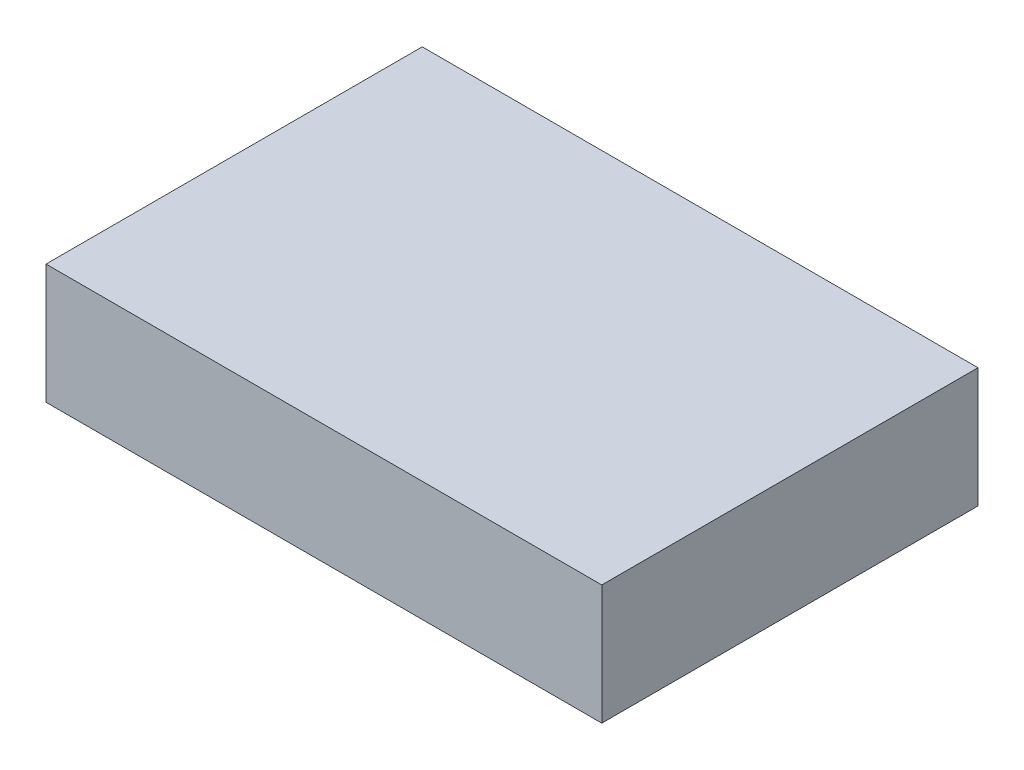
ISO-10303-21;
HEADER;
FILE_DESCRIPTION(('STEP AP214'),'2;1');
FILE_NAME('part.step','',(''),(''),'','','');
FILE_SCHEMA(('AUTOMOTIVE_DESIGN { 1 0 10303 214 1 1 1 1 }'));
ENDSEC;
DATA;
#1=APPLICATION_CONTEXT('core data for automotive mechanical design processes');
#2=APPLICATION_PROTOCOL_DEFINITION('international standard','automotive_design',2000,#1);
#3=PRODUCT_CONTEXT('',#1,'mechanical');
#4=PRODUCT('Part','Part','',(#3));
#5=PRODUCT_RELATED_PRODUCT_CATEGORY('part','',(#4));
#6=PRODUCT_DEFINITION_FORMATION('','',#4);
#7=PRODUCT_DEFINITION_CONTEXT('part definition',#1,'design');
#8=PRODUCT_DEFINITION('design','',#6,#7);
#9=PRODUCT_DEFINITION_SHAPE('','',#8);
#10=(LENGTH_UNIT() NAMED_UNIT(*) SI_UNIT(.MILLI.,.METRE.));
#11=(NAMED_UNIT(*) PLANE_ANGLE_UNIT() SI_UNIT($,.RADIAN.));
#12=(NAMED_UNIT(*) SI_UNIT($,.STERADIAN.) SOLID_ANGLE_UNIT());
#13=UNCERTAINTY_MEASURE_WITH_UNIT(LENGTH_MEASURE(1.E-05),#10,'distance_accuracy_value','');
#14=(GEOMETRIC_REPRESENTATION_CONTEXT(3) GLOBAL_UNCERTAINTY_ASSIGNED_CONTEXT((#13)) GLOBAL_UNIT_ASSIGNED_CONTEXT((#10,
#11,#12)) REPRESENTATION_CONTEXT('',''));
#15=CARTESIAN_POINT('',(0.,0.,0.));
#16=DIRECTION('',(0.,0.,1.));
#17=DIRECTION('',(1.,0.,0.));
#18=AXIS2_PLACEMENT_3D('',#15,#16,#17);
#19=CARTESIAN_POINT('',(0.,3.556,0.));
#20=DIRECTION('',(1.,0.,0.));
#21=DIRECTION('',(0.,0.,-1.));
#22=AXIS2_PLACEMENT_3D('',#19,#20,#21);
#23=PLANE('',#22);
#24=DIRECTION('',(0.,0.,1.));
#25=VECTOR('',#24,1.);
#26=CARTESIAN_POINT('',(0.,0.,0.));
#27=LINE('',#26,#25);
#28=CARTESIAN_POINT('',(0.,0.,-11.176));
#29=VERTEX_POINT('',#28);
#30=CARTESIAN_POINT('',(0.,0.,0.));
#31=VERTEX_POINT('',#30);
#32=EDGE_CURVE('E73',#29,#31,#27,.T.);
#33=ORIENTED_EDGE('',*,*,#32,.T.);
#34=DIRECTION('',(0.,-1.,0.));
#35=VECTOR('',#34,1.);
#36=CARTESIAN_POINT('',(0.,3.556,0.));
#37=LINE('',#36,#35);
#38=CARTESIAN_POINT('',(0.,3.556,0.));
#39=VERTEX_POINT('',#38);
#40=EDGE_CURVE('E11',#39,#31,#37,.T.);
#41=ORIENTED_EDGE('',*,*,#40,.F.);
#42=DIRECTION('',(0.,0.,1.));
#43=VECTOR('',#42,1.);
#44=CARTESIAN_POINT('',(0.,3.556,0.));
#45=LINE('',#44,#43);
#46=CARTESIAN_POINT('',(0.,3.556,-11.176));
#47=VERTEX_POINT('',#46);
#48=EDGE_CURVE('E91',#47,#39,#45,.T.);
#49=ORIENTED_EDGE('',*,*,#48,.F.);
#50=DIRECTION('',(0.,-1.,0.));
#51=VECTOR('',#50,1.);
#52=CARTESIAN_POINT('',(0.,3.556,-11.176));
#53=LINE('',#52,#51);
#54=EDGE_CURVE('E85',#47,#29,#53,.T.);
#55=ORIENTED_EDGE('',*,*,#54,.T.);
#56=EDGE_LOOP('',(#33,#41,#49,#55));
#57=FACE_BOUND('',#56,.T.);
#58=ADVANCED_FACE('F29',(#57),#23,.F.);
#59=CARTESIAN_POINT('',(0.,3.556,0.));
#60=DIRECTION('',(0.,0.,-1.));
#61=DIRECTION('',(-1.,0.,0.));
#62=AXIS2_PLACEMENT_3D('',#59,#60,#61);
#63=PLANE('',#62);
#64=DIRECTION('',(1.,0.,0.));
#65=VECTOR('',#64,1.);
#66=CARTESIAN_POINT('',(0.,0.,0.));
#67=LINE('',#66,#65);
#68=CARTESIAN_POINT('',(16.51,0.,0.));
#69=VERTEX_POINT('',#68);
#70=EDGE_CURVE('E69',#31,#69,#67,.T.);
#71=ORIENTED_EDGE('',*,*,#70,.T.);
#72=DIRECTION('',(0.,-1.,0.));
#73=VECTOR('',#72,1.);
#74=CARTESIAN_POINT('',(16.51,3.556,0.));
#75=LINE('',#74,#73);
#76=CARTESIAN_POINT('',(16.51,3.556,0.));
#77=VERTEX_POINT('',#76);
#78=EDGE_CURVE('E36',#77,#69,#75,.T.);
#79=ORIENTED_EDGE('',*,*,#78,.F.);
#80=DIRECTION('',(1.,0.,0.));
#81=VECTOR('',#80,1.);
#82=CARTESIAN_POINT('',(0.,3.556,0.));
#83=LINE('',#82,#81);
#84=EDGE_CURVE('E81',#39,#77,#83,.T.);
#85=ORIENTED_EDGE('',*,*,#84,.F.);
#86=ORIENTED_EDGE('',*,*,#40,.T.);
#87=EDGE_LOOP('',(#71,#79,#85,#86));
#88=FACE_BOUND('',#87,.T.);
#89=ADVANCED_FACE('F80',(#88),#63,.F.);
#90=CARTESIAN_POINT('',(16.51,3.556,0.));
#91=DIRECTION('',(-1.,0.,0.));
#92=DIRECTION('',(0.,0.,1.));
#93=AXIS2_PLACEMENT_3D('',#90,#91,#92);
#94=PLANE('',#93);
#95=DIRECTION('',(0.,0.,-1.));
#96=VECTOR('',#95,1.);
#97=CARTESIAN_POINT('',(16.51,0.,0.));
#98=LINE('',#97,#96);
#99=CARTESIAN_POINT('',(16.51,0.,-11.176));
#100=VERTEX_POINT('',#99);
#101=EDGE_CURVE('E74',#69,#100,#98,.T.);
#102=ORIENTED_EDGE('',*,*,#101,.T.);
#103=DIRECTION('',(0.,-1.,0.));
#104=VECTOR('',#103,1.);
#105=CARTESIAN_POINT('',(16.51,3.556,-11.176));
#106=LINE('',#105,#104);
#107=CARTESIAN_POINT('',(16.51,3.556,-11.176));
#108=VERTEX_POINT('',#107);
#109=EDGE_CURVE('E97',#108,#100,#106,.T.);
#110=ORIENTED_EDGE('',*,*,#109,.F.);
#111=DIRECTION('',(0.,0.,-1.));
#112=VECTOR('',#111,1.);
#113=CARTESIAN_POINT('',(16.51,3.556,0.));
#114=LINE('',#113,#112);
#115=EDGE_CURVE('E48',#77,#108,#114,.T.);
#116=ORIENTED_EDGE('',*,*,#115,.F.);
#117=ORIENTED_EDGE('',*,*,#78,.T.);
#118=EDGE_LOOP('',(#102,#110,#116,#117));
#119=FACE_BOUND('',#118,.T.);
#120=ADVANCED_FACE('F100',(#119),#94,.F.);
#121=CARTESIAN_POINT('',(0.,3.556,-11.176));
#122=DIRECTION('',(0.,0.,1.));
#123=DIRECTION('',(1.,0.,0.));
#124=AXIS2_PLACEMENT_3D('',#121,#122,#123);
#125=PLANE('',#124);
#126=DIRECTION('',(-1.,0.,0.));
#127=VECTOR('',#126,1.);
#128=CARTESIAN_POINT('',(0.,0.,-11.176));
#129=LINE('',#128,#127);
#130=EDGE_CURVE('E89',#100,#29,#129,.T.);
#131=ORIENTED_EDGE('',*,*,#130,.T.);
#132=ORIENTED_EDGE('',*,*,#54,.F.);
#133=DIRECTION('',(-1.,0.,0.));
#134=VECTOR('',#133,1.);
#135=CARTESIAN_POINT('',(0.,3.556,-11.176));
#136=LINE('',#135,#134);
#137=EDGE_CURVE('E43',#108,#47,#136,.T.);
#138=ORIENTED_EDGE('',*,*,#137,.F.);
#139=ORIENTED_EDGE('',*,*,#109,.T.);
#140=EDGE_LOOP('',(#131,#132,#138,#139));
#141=FACE_BOUND('',#140,.T.);
#142=ADVANCED_FACE('F102',(#141),#125,.F.);
#143=CARTESIAN_POINT('',(0.,3.556,-11.176));
#144=DIRECTION('',(0.,-1.,0.));
#145=DIRECTION('',(0.,0.,-1.));
#146=AXIS2_PLACEMENT_3D('',#143,#144,#145);
#147=PLANE('',#146);
#148=ORIENTED_EDGE('',*,*,#48,.T.);
#149=ORIENTED_EDGE('',*,*,#84,.T.);
#150=ORIENTED_EDGE('',*,*,#115,.T.);
#151=ORIENTED_EDGE('',*,*,#137,.T.);
#152=EDGE_LOOP('',(#148,#149,#150,#151));
#153=FACE_BOUND('',#152,.T.);
#154=ADVANCED_FACE('F103',(#153),#147,.F.);
#155=CARTESIAN_POINT('',(0.,0.,-11.176));
#156=DIRECTION('',(0.,-1.,0.));
#157=DIRECTION('',(0.,0.,-1.));
#158=AXIS2_PLACEMENT_3D('',#155,#156,#157);
#159=PLANE('',#158);
#160=ORIENTED_EDGE('',*,*,#32,.F.);
#161=ORIENTED_EDGE('',*,*,#130,.F.);
#162=ORIENTED_EDGE('',*,*,#101,.F.);
#163=ORIENTED_EDGE('',*,*,#70,.F.);
#164=EDGE_LOOP('',(#160,#161,#162,#163));
#165=FACE_BOUND('',#164,.T.);
#166=ADVANCED_FACE('F70',(#165),#159,.T.);
#167=CLOSED_SHELL('',(#58,#89,#120,#142,#154,#166));
#168=MANIFOLD_SOLID_BREP('B2',#167);
#169=ADVANCED_BREP_SHAPE_REPRESENTATION('',(#18,#168),#14);
#170=SHAPE_DEFINITION_REPRESENTATION(#9,#169);
ENDSEC;
END-ISO-10303-21;
